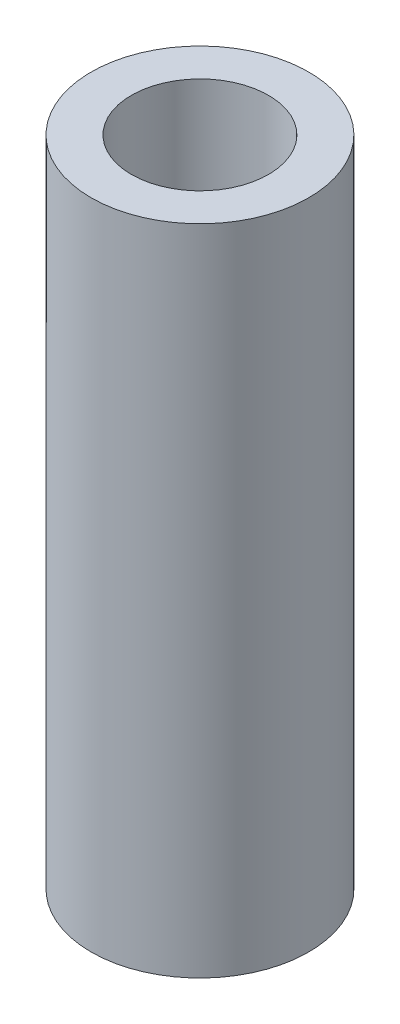
ISO-10303-21;
HEADER;
FILE_DESCRIPTION(('STEP AP214'),'2;1');
FILE_NAME('part.step','',(''),(''),'','','');
FILE_SCHEMA(('AUTOMOTIVE_DESIGN { 1 0 10303 214 1 1 1 1 }'));
ENDSEC;
DATA;
#1=APPLICATION_CONTEXT('core data for automotive mechanical design processes');
#2=APPLICATION_PROTOCOL_DEFINITION('international standard','automotive_design',2000,#1);
#3=PRODUCT_CONTEXT('',#1,'mechanical');
#4=PRODUCT('Part','Part','',(#3));
#5=PRODUCT_RELATED_PRODUCT_CATEGORY('part','',(#4));
#6=PRODUCT_DEFINITION_FORMATION('','',#4);
#7=PRODUCT_DEFINITION_CONTEXT('part definition',#1,'design');
#8=PRODUCT_DEFINITION('design','',#6,#7);
#9=PRODUCT_DEFINITION_SHAPE('','',#8);
#10=(LENGTH_UNIT() NAMED_UNIT(*) SI_UNIT(.MILLI.,.METRE.));
#11=(NAMED_UNIT(*) PLANE_ANGLE_UNIT() SI_UNIT($,.RADIAN.));
#12=(NAMED_UNIT(*) SI_UNIT($,.STERADIAN.) SOLID_ANGLE_UNIT());
#13=UNCERTAINTY_MEASURE_WITH_UNIT(LENGTH_MEASURE(1.E-05),#10,'distance_accuracy_value','');
#14=(GEOMETRIC_REPRESENTATION_CONTEXT(3) GLOBAL_UNCERTAINTY_ASSIGNED_CONTEXT((#13)) GLOBAL_UNIT_ASSIGNED_CONTEXT((#10,
#11,#12)) REPRESENTATION_CONTEXT('',''));
#15=CARTESIAN_POINT('',(0.,0.,0.));
#16=DIRECTION('',(0.,0.,1.));
#17=DIRECTION('',(1.,0.,0.));
#18=AXIS2_PLACEMENT_3D('',#15,#16,#17);
#19=CARTESIAN_POINT('',(0.,-19.05,0.));
#20=DIRECTION('',(0.,1.,0.));
#21=DIRECTION('',(0.,0.,1.));
#22=AXIS2_PLACEMENT_3D('',#19,#20,#21);
#23=CYLINDRICAL_SURFACE('',#22,3.175);
#24=CARTESIAN_POINT('',(0.,-19.05,0.));
#25=DIRECTION('',(0.,1.,0.));
#26=DIRECTION('',(0.,0.,1.));
#27=AXIS2_PLACEMENT_3D('',#24,#25,#26);
#28=CIRCLE('',#27,3.175);
#29=CARTESIAN_POINT('',(0.,-19.05,3.175));
#30=VERTEX_POINT('',#29);
#31=EDGE_CURVE('E10',#30,#30,#28,.T.);
#32=CARTESIAN_POINT('',(0.,0.,0.));
#33=DIRECTION('',(0.,1.,0.));
#34=DIRECTION('',(0.,0.,1.));
#35=AXIS2_PLACEMENT_3D('',#32,#33,#34);
#36=CIRCLE('',#35,3.175);
#37=CARTESIAN_POINT('',(0.,0.,3.175));
#38=VERTEX_POINT('',#37);
#39=EDGE_CURVE('E44',#38,#38,#36,.T.);
#40=CARTESIAN_POINT('',(0.,-19.05,3.175));
#41=CARTESIAN_POINT('',(0.,-18.8515625,3.175));
#42=CARTESIAN_POINT('',(0.,-18.653125,3.175));
#43=CARTESIAN_POINT('',(0.,-18.25625,3.175));
#44=CARTESIAN_POINT('',(0.,-18.0578125,3.175));
#45=CARTESIAN_POINT('',(0.,-17.6609375,3.175));
#46=CARTESIAN_POINT('',(0.,-17.4625,3.175));
#47=CARTESIAN_POINT('',(0.,-17.065625,3.175));
#48=CARTESIAN_POINT('',(0.,-16.8671875,3.175));
#49=CARTESIAN_POINT('',(0.,-16.4703125,3.175));
#50=CARTESIAN_POINT('',(0.,-16.271875,3.175));
#51=CARTESIAN_POINT('',(0.,-15.875,3.175));
#52=CARTESIAN_POINT('',(0.,-15.6765625,3.175));
#53=CARTESIAN_POINT('',(0.,-15.2796875,3.175));
#54=CARTESIAN_POINT('',(0.,-15.08125,3.175));
#55=CARTESIAN_POINT('',(0.,-14.684375,3.175));
#56=CARTESIAN_POINT('',(0.,-14.4859375,3.175));
#57=CARTESIAN_POINT('',(0.,-14.0890625,3.175));
#58=CARTESIAN_POINT('',(0.,-13.890625,3.175));
#59=CARTESIAN_POINT('',(0.,-13.49375,3.175));
#60=CARTESIAN_POINT('',(0.,-13.2953125,3.175));
#61=CARTESIAN_POINT('',(0.,-12.8984375,3.175));
#62=CARTESIAN_POINT('',(0.,-12.7,3.175));
#63=CARTESIAN_POINT('',(0.,-12.303125,3.175));
#64=CARTESIAN_POINT('',(0.,-12.1046875,3.175));
#65=CARTESIAN_POINT('',(0.,-11.7078125,3.175));
#66=CARTESIAN_POINT('',(0.,-11.509375,3.175));
#67=CARTESIAN_POINT('',(0.,-11.1125,3.175));
#68=CARTESIAN_POINT('',(0.,-10.9140625,3.175));
#69=CARTESIAN_POINT('',(0.,-10.5171875,3.175));
#70=CARTESIAN_POINT('',(0.,-10.31875,3.175));
#71=CARTESIAN_POINT('',(0.,-9.921875,3.175));
#72=CARTESIAN_POINT('',(0.,-9.7234375,3.175));
#73=CARTESIAN_POINT('',(0.,-9.3265625,3.175));
#74=CARTESIAN_POINT('',(0.,-9.128125,3.175));
#75=CARTESIAN_POINT('',(0.,-8.73125,3.175));
#76=CARTESIAN_POINT('',(0.,-8.5328125,3.175));
#77=CARTESIAN_POINT('',(0.,-8.1359375,3.175));
#78=CARTESIAN_POINT('',(0.,-7.9375,3.175));
#79=CARTESIAN_POINT('',(0.,-7.540625,3.175));
#80=CARTESIAN_POINT('',(0.,-7.3421875,3.175));
#81=CARTESIAN_POINT('',(0.,-6.9453125,3.175));
#82=CARTESIAN_POINT('',(0.,-6.746875,3.175));
#83=CARTESIAN_POINT('',(0.,-6.35,3.175));
#84=CARTESIAN_POINT('',(0.,-6.1515625,3.175));
#85=CARTESIAN_POINT('',(0.,-5.7546875,3.175));
#86=CARTESIAN_POINT('',(0.,-5.55625,3.175));
#87=CARTESIAN_POINT('',(0.,-5.159375,3.175));
#88=CARTESIAN_POINT('',(0.,-4.9609375,3.175));
#89=CARTESIAN_POINT('',(0.,-4.5640625,3.175));
#90=CARTESIAN_POINT('',(0.,-4.365625,3.175));
#91=CARTESIAN_POINT('',(0.,-3.96875,3.175));
#92=CARTESIAN_POINT('',(0.,-3.7703125,3.175));
#93=CARTESIAN_POINT('',(0.,-3.3734375,3.175));
#94=CARTESIAN_POINT('',(0.,-3.175,3.175));
#95=CARTESIAN_POINT('',(0.,-2.778125,3.175));
#96=CARTESIAN_POINT('',(0.,-2.5796875,3.175));
#97=CARTESIAN_POINT('',(0.,-2.1828125,3.175));
#98=CARTESIAN_POINT('',(0.,-1.984375,3.175));
#99=CARTESIAN_POINT('',(0.,-1.5875,3.175));
#100=CARTESIAN_POINT('',(0.,-1.3890625,3.175));
#101=CARTESIAN_POINT('',(0.,-0.992187500000001,3.175));
#102=CARTESIAN_POINT('',(0.,-0.793750000000001,3.175));
#103=CARTESIAN_POINT('',(0.,-0.396875,3.175));
#104=CARTESIAN_POINT('',(0.,-0.1984375,3.175));
#105=CARTESIAN_POINT('',(0.,0.,3.175));
#106=B_SPLINE_CURVE_WITH_KNOTS('',3,(#40,#41,#42,#43,#44,#45,#46,#47,#48,#49,#50,#51,#52,#53,
#54,#55,#56,#57,#58,#59,#60,#61,#62,#63,#64,#65,#66,#67,#68,#69,#70,#71,#72,#73,#74,#75,#76,#77,
#78,#79,#80,#81,#82,#83,#84,#85,#86,#87,#88,#89,#90,#91,#92,#93,#94,#95,#96,#97,#98,#99,#100,
#101,#102,#103,#104,#105),.UNSPECIFIED.,.F.,.F.,(4,2,2,2,2,2,2,2,2,2,2,2,2,2,2,2,2,2,2,2,2,2,2,
2,2,2,2,2,2,2,2,2,4),(0.,0.5953125,1.190625,1.7859375,2.38125,2.9765625,3.571875,4.1671875,
4.7625,5.3578125,5.953125,6.5484375,7.14375,7.7390625,8.334375,8.9296875,9.525,10.1203125,
10.715625,11.3109375,11.90625,12.5015625,13.096875,13.6921875,14.2875,14.8828125,15.478125,
16.0734375,16.66875,17.2640625,17.859375,18.4546875,19.05),.UNSPECIFIED.);
#107=EDGE_CURVE('BSEAM41',#30,#38,#106,.T.);
#108=ORIENTED_EDGE('',*,*,#31,.T.);
#109=ORIENTED_EDGE('',*,*,#39,.F.);
#110=ORIENTED_EDGE('',*,*,#107,.T.);
#111=ORIENTED_EDGE('',*,*,#107,.F.);
#112=EDGE_LOOP('',(#108,#110,#109,#111));
#113=FACE_BOUND('',#112,.T.);
#114=ADVANCED_FACE('F41',(#113),#23,.T.);
#115=CARTESIAN_POINT('',(0.,-19.05,0.));
#116=DIRECTION('',(0.,1.,0.));
#117=DIRECTION('',(0.,0.,1.));
#118=AXIS2_PLACEMENT_3D('',#115,#116,#117);
#119=PLANE('',#118);
#120=CARTESIAN_POINT('',(0.,-19.05,0.));
#121=DIRECTION('',(0.,1.,0.));
#122=DIRECTION('',(0.,0.,1.));
#123=AXIS2_PLACEMENT_3D('',#120,#121,#122);
#124=CIRCLE('',#123,2.);
#125=CARTESIAN_POINT('',(0.,-19.05,2.));
#126=VERTEX_POINT('',#125);
#127=EDGE_CURVE('E51',#126,#126,#124,.T.);
#128=ORIENTED_EDGE('',*,*,#127,.T.);
#129=EDGE_LOOP('',(#128));
#130=FACE_BOUND('',#129,.T.);
#131=ORIENTED_EDGE('',*,*,#31,.F.);
#132=EDGE_LOOP('',(#131));
#133=FACE_BOUND('',#132,.T.);
#134=ADVANCED_FACE('F59',(#130,#133),#119,.F.);
#135=CARTESIAN_POINT('',(0.,0.,0.));
#136=DIRECTION('',(0.,1.,0.));
#137=DIRECTION('',(0.,0.,1.));
#138=AXIS2_PLACEMENT_3D('',#135,#136,#137);
#139=PLANE('',#138);
#140=CARTESIAN_POINT('',(0.,0.,0.));
#141=DIRECTION('',(0.,1.,0.));
#142=DIRECTION('',(0.,0.,1.));
#143=AXIS2_PLACEMENT_3D('',#140,#141,#142);
#144=CIRCLE('',#143,2.);
#145=CARTESIAN_POINT('',(0.,0.,2.));
#146=VERTEX_POINT('',#145);
#147=EDGE_CURVE('E53',#146,#146,#144,.T.);
#148=ORIENTED_EDGE('',*,*,#147,.F.);
#149=EDGE_LOOP('',(#148));
#150=FACE_BOUND('',#149,.T.);
#151=ORIENTED_EDGE('',*,*,#39,.T.);
#152=EDGE_LOOP('',(#151));
#153=FACE_BOUND('',#152,.T.);
#154=ADVANCED_FACE('F65',(#150,#153),#139,.T.);
#155=CARTESIAN_POINT('',(0.,-19.05,0.));
#156=DIRECTION('',(0.,1.,0.));
#157=DIRECTION('',(0.,0.,1.));
#158=AXIS2_PLACEMENT_3D('',#155,#156,#157);
#159=CYLINDRICAL_SURFACE('',#158,2.);
#160=CARTESIAN_POINT('',(0.,-19.05,2.));
#161=CARTESIAN_POINT('',(0.,-18.8515625,2.));
#162=CARTESIAN_POINT('',(0.,-18.653125,2.));
#163=CARTESIAN_POINT('',(0.,-18.25625,2.));
#164=CARTESIAN_POINT('',(0.,-18.0578125,2.));
#165=CARTESIAN_POINT('',(0.,-17.6609375,2.));
#166=CARTESIAN_POINT('',(0.,-17.4625,2.));
#167=CARTESIAN_POINT('',(0.,-17.065625,2.));
#168=CARTESIAN_POINT('',(0.,-16.8671875,2.));
#169=CARTESIAN_POINT('',(0.,-16.4703125,2.));
#170=CARTESIAN_POINT('',(0.,-16.271875,2.));
#171=CARTESIAN_POINT('',(0.,-15.875,2.));
#172=CARTESIAN_POINT('',(0.,-15.6765625,2.));
#173=CARTESIAN_POINT('',(0.,-15.2796875,2.));
#174=CARTESIAN_POINT('',(0.,-15.08125,2.));
#175=CARTESIAN_POINT('',(0.,-14.684375,2.));
#176=CARTESIAN_POINT('',(0.,-14.4859375,2.));
#177=CARTESIAN_POINT('',(0.,-14.0890625,2.));
#178=CARTESIAN_POINT('',(0.,-13.890625,2.));
#179=CARTESIAN_POINT('',(0.,-13.49375,2.));
#180=CARTESIAN_POINT('',(0.,-13.2953125,2.));
#181=CARTESIAN_POINT('',(0.,-12.8984375,2.));
#182=CARTESIAN_POINT('',(0.,-12.7,2.));
#183=CARTESIAN_POINT('',(0.,-12.303125,2.));
#184=CARTESIAN_POINT('',(0.,-12.1046875,2.));
#185=CARTESIAN_POINT('',(0.,-11.7078125,2.));
#186=CARTESIAN_POINT('',(0.,-11.509375,2.));
#187=CARTESIAN_POINT('',(0.,-11.1125,2.));
#188=CARTESIAN_POINT('',(0.,-10.9140625,2.));
#189=CARTESIAN_POINT('',(0.,-10.5171875,2.));
#190=CARTESIAN_POINT('',(0.,-10.31875,2.));
#191=CARTESIAN_POINT('',(0.,-9.921875,2.));
#192=CARTESIAN_POINT('',(0.,-9.7234375,2.));
#193=CARTESIAN_POINT('',(0.,-9.3265625,2.));
#194=CARTESIAN_POINT('',(0.,-9.128125,2.));
#195=CARTESIAN_POINT('',(0.,-8.73125,2.));
#196=CARTESIAN_POINT('',(0.,-8.5328125,2.));
#197=CARTESIAN_POINT('',(0.,-8.1359375,2.));
#198=CARTESIAN_POINT('',(0.,-7.9375,2.));
#199=CARTESIAN_POINT('',(0.,-7.540625,2.));
#200=CARTESIAN_POINT('',(0.,-7.3421875,2.));
#201=CARTESIAN_POINT('',(0.,-6.9453125,2.));
#202=CARTESIAN_POINT('',(0.,-6.746875,2.));
#203=CARTESIAN_POINT('',(0.,-6.35,2.));
#204=CARTESIAN_POINT('',(0.,-6.1515625,2.));
#205=CARTESIAN_POINT('',(0.,-5.7546875,2.));
#206=CARTESIAN_POINT('',(0.,-5.55625,2.));
#207=CARTESIAN_POINT('',(0.,-5.159375,2.));
#208=CARTESIAN_POINT('',(0.,-4.9609375,2.));
#209=CARTESIAN_POINT('',(0.,-4.5640625,2.));
#210=CARTESIAN_POINT('',(0.,-4.365625,2.));
#211=CARTESIAN_POINT('',(0.,-3.96875,2.));
#212=CARTESIAN_POINT('',(0.,-3.7703125,2.));
#213=CARTESIAN_POINT('',(0.,-3.3734375,2.));
#214=CARTESIAN_POINT('',(0.,-3.175,2.));
#215=CARTESIAN_POINT('',(0.,-2.778125,2.));
#216=CARTESIAN_POINT('',(0.,-2.5796875,2.));
#217=CARTESIAN_POINT('',(0.,-2.1828125,2.));
#218=CARTESIAN_POINT('',(0.,-1.984375,2.));
#219=CARTESIAN_POINT('',(0.,-1.5875,2.));
#220=CARTESIAN_POINT('',(0.,-1.3890625,2.));
#221=CARTESIAN_POINT('',(0.,-0.992187500000001,2.));
#222=CARTESIAN_POINT('',(0.,-0.793750000000001,2.));
#223=CARTESIAN_POINT('',(0.,-0.396875,2.));
#224=CARTESIAN_POINT('',(0.,-0.1984375,2.));
#225=CARTESIAN_POINT('',(0.,0.,2.));
#226=B_SPLINE_CURVE_WITH_KNOTS('',3,(#160,#161,#162,#163,#164,#165,#166,#167,#168,#169,#170,
#171,#172,#173,#174,#175,#176,#177,#178,#179,#180,#181,#182,#183,#184,#185,#186,#187,#188,#189,
#190,#191,#192,#193,#194,#195,#196,#197,#198,#199,#200,#201,#202,#203,#204,#205,#206,#207,#208,
#209,#210,#211,#212,#213,#214,#215,#216,#217,#218,#219,#220,#221,#222,#223,#224,#225),
.UNSPECIFIED.,.F.,.F.,(4,2,2,2,2,2,2,2,2,2,2,2,2,2,2,2,2,2,2,2,2,2,2,2,2,2,2,2,2,2,2,2,4),(0.,
0.595312499999997,1.190625,1.7859375,2.38125,2.9765625,3.571875,4.1671875,4.7625,5.3578125,
5.953125,6.5484375,7.14375,7.7390625,8.334375,8.9296875,9.525,10.1203125,10.715625,11.3109375,
11.90625,12.5015625,13.096875,13.6921875,14.2875,14.8828125,15.478125,16.0734375,16.66875,
17.2640625,17.859375,18.4546875,19.05),.UNSPECIFIED.);
#227=EDGE_CURVE('BSEAM62',#126,#146,#226,.T.);
#228=ORIENTED_EDGE('',*,*,#127,.F.);
#229=ORIENTED_EDGE('',*,*,#147,.T.);
#230=ORIENTED_EDGE('',*,*,#227,.T.);
#231=ORIENTED_EDGE('',*,*,#227,.F.);
#232=EDGE_LOOP('',(#228,#230,#229,#231));
#233=FACE_BOUND('',#232,.T.);
#234=ADVANCED_FACE('F62',(#233),#159,.F.);
#235=CLOSED_SHELL('',(#114,#134,#154,#234));
#236=MANIFOLD_SOLID_BREP('B2',#235);
#237=ADVANCED_BREP_SHAPE_REPRESENTATION('',(#18,#236),#14);
#238=SHAPE_DEFINITION_REPRESENTATION(#9,#237);
ENDSEC;
END-ISO-10303-21;
